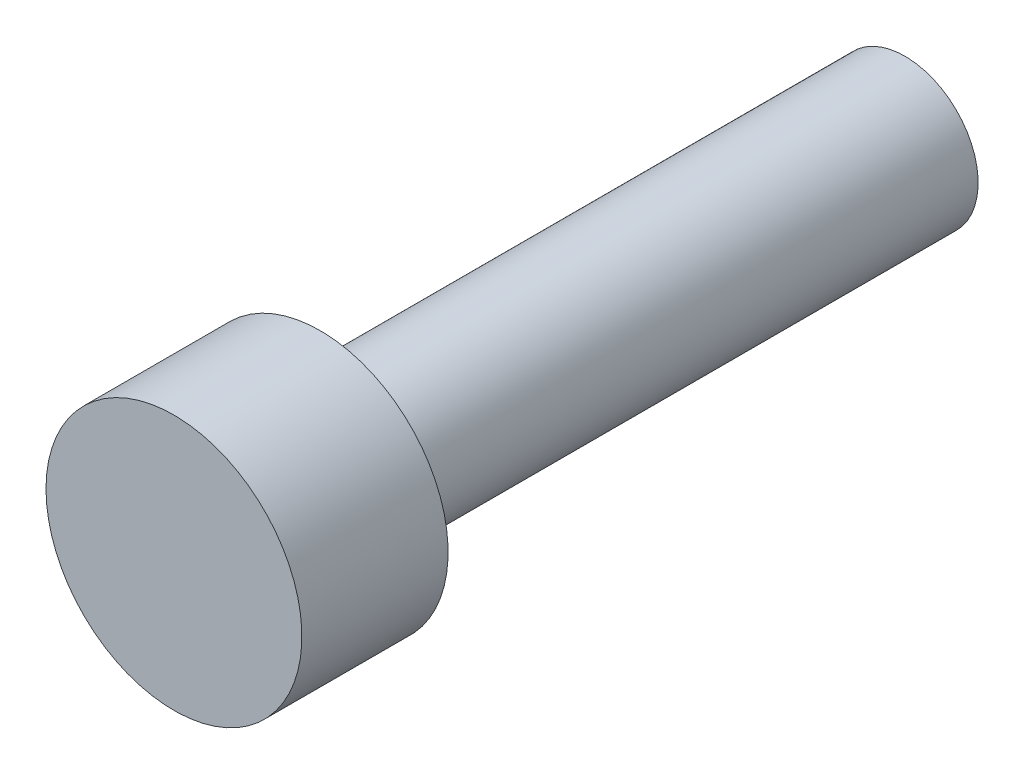
ISO-10303-21;
HEADER;
FILE_DESCRIPTION(('STEP AP214'),'2;1');
FILE_NAME('part.step','',(''),(''),'','','');
FILE_SCHEMA(('AUTOMOTIVE_DESIGN { 1 0 10303 214 1 1 1 1 }'));
ENDSEC;
DATA;
#1=APPLICATION_CONTEXT('core data for automotive mechanical design processes');
#2=APPLICATION_PROTOCOL_DEFINITION('international standard','automotive_design',2000,#1);
#3=PRODUCT_CONTEXT('',#1,'mechanical');
#4=PRODUCT('Part','Part','',(#3));
#5=PRODUCT_RELATED_PRODUCT_CATEGORY('part','',(#4));
#6=PRODUCT_DEFINITION_FORMATION('','',#4);
#7=PRODUCT_DEFINITION_CONTEXT('part definition',#1,'design');
#8=PRODUCT_DEFINITION('design','',#6,#7);
#9=PRODUCT_DEFINITION_SHAPE('','',#8);
#10=(LENGTH_UNIT() NAMED_UNIT(*) SI_UNIT(.MILLI.,.METRE.));
#11=(NAMED_UNIT(*) PLANE_ANGLE_UNIT() SI_UNIT($,.RADIAN.));
#12=(NAMED_UNIT(*) SI_UNIT($,.STERADIAN.) SOLID_ANGLE_UNIT());
#13=UNCERTAINTY_MEASURE_WITH_UNIT(LENGTH_MEASURE(1.E-05),#10,'distance_accuracy_value','');
#14=(GEOMETRIC_REPRESENTATION_CONTEXT(3) GLOBAL_UNCERTAINTY_ASSIGNED_CONTEXT((#13)) GLOBAL_UNIT_ASSIGNED_CONTEXT((#10,
#11,#12)) REPRESENTATION_CONTEXT('',''));
#15=CARTESIAN_POINT('',(0.,0.,0.));
#16=DIRECTION('',(0.,0.,1.));
#17=DIRECTION('',(1.,0.,0.));
#18=AXIS2_PLACEMENT_3D('',#15,#16,#17);
#19=CARTESIAN_POINT('',(0.,0.,4.));
#20=DIRECTION('',(0.,0.,-1.));
#21=DIRECTION('',(-1.,0.,0.));
#22=AXIS2_PLACEMENT_3D('',#19,#20,#21);
#23=PLANE('',#22);
#24=CARTESIAN_POINT('',(0.,0.,4.));
#25=DIRECTION('',(0.,0.,-1.));
#26=DIRECTION('',(-1.,0.,0.));
#27=AXIS2_PLACEMENT_3D('',#24,#25,#26);
#28=CIRCLE('',#27,3.5);
#29=CARTESIAN_POINT('',(-3.5,0.,4.));
#30=VERTEX_POINT('',#29);
#31=EDGE_CURVE('E10',#30,#30,#28,.T.);
#32=ORIENTED_EDGE('',*,*,#31,.F.);
#33=EDGE_LOOP('',(#32));
#34=FACE_BOUND('',#33,.T.);
#35=ADVANCED_FACE('F34',(#34),#23,.F.);
#36=CARTESIAN_POINT('',(0.,0.,-16.));
#37=DIRECTION('',(0.,0.,-1.));
#38=DIRECTION('',(-1.,0.,0.));
#39=AXIS2_PLACEMENT_3D('',#36,#37,#38);
#40=CYLINDRICAL_SURFACE('',#39,3.5);
#41=CARTESIAN_POINT('',(0.,0.,0.));
#42=DIRECTION('',(0.,0.,-1.));
#43=DIRECTION('',(-1.,0.,0.));
#44=AXIS2_PLACEMENT_3D('',#41,#42,#43);
#45=CIRCLE('',#44,3.5);
#46=CARTESIAN_POINT('',(-3.5,0.,0.));
#47=VERTEX_POINT('',#46);
#48=EDGE_CURVE('E45',#47,#47,#45,.T.);
#49=ORIENTED_EDGE('',*,*,#48,.F.);
#50=EDGE_LOOP('',(#49));
#51=FACE_BOUND('',#50,.T.);
#52=ORIENTED_EDGE('',*,*,#31,.T.);
#53=EDGE_LOOP('',(#52));
#54=FACE_BOUND('',#53,.T.);
#55=ADVANCED_FACE('F75',(#51,#54),#40,.T.);
#56=CARTESIAN_POINT('',(3.5,0.,0.));
#57=DIRECTION('',(0.,0.,1.));
#58=DIRECTION('',(1.,0.,0.));
#59=AXIS2_PLACEMENT_3D('',#56,#57,#58);
#60=PLANE('',#59);
#61=CARTESIAN_POINT('',(0.,0.,0.));
#62=DIRECTION('',(0.,0.,-1.));
#63=DIRECTION('',(-1.,0.,0.));
#64=AXIS2_PLACEMENT_3D('',#61,#62,#63);
#65=CIRCLE('',#64,2.);
#66=CARTESIAN_POINT('',(-2.,0.,0.));
#67=VERTEX_POINT('',#66);
#68=EDGE_CURVE('E48',#67,#67,#65,.T.);
#69=ORIENTED_EDGE('',*,*,#68,.F.);
#70=EDGE_LOOP('',(#69));
#71=FACE_BOUND('',#70,.T.);
#72=ORIENTED_EDGE('',*,*,#48,.T.);
#73=EDGE_LOOP('',(#72));
#74=FACE_BOUND('',#73,.T.);
#75=ADVANCED_FACE('F67',(#71,#74),#60,.F.);
#76=CARTESIAN_POINT('',(0.,0.,-16.));
#77=DIRECTION('',(0.,0.,-1.));
#78=DIRECTION('',(-1.,0.,0.));
#79=AXIS2_PLACEMENT_3D('',#76,#77,#78);
#80=CYLINDRICAL_SURFACE('',#79,2.);
#81=CARTESIAN_POINT('',(0.,0.,-16.));
#82=DIRECTION('',(0.,0.,-1.));
#83=DIRECTION('',(-1.,0.,0.));
#84=AXIS2_PLACEMENT_3D('',#81,#82,#83);
#85=CIRCLE('',#84,2.);
#86=CARTESIAN_POINT('',(-2.00000000000001,0.,-16.));
#87=VERTEX_POINT('',#86);
#88=EDGE_CURVE('E53',#87,#87,#85,.T.);
#89=ORIENTED_EDGE('',*,*,#88,.F.);
#90=EDGE_LOOP('',(#89));
#91=FACE_BOUND('',#90,.T.);
#92=ORIENTED_EDGE('',*,*,#68,.T.);
#93=EDGE_LOOP('',(#92));
#94=FACE_BOUND('',#93,.T.);
#95=ADVANCED_FACE('F61',(#91,#94),#80,.T.);
#96=CARTESIAN_POINT('',(1.99999999999999,0.,-16.));
#97=DIRECTION('',(0.,0.,1.));
#98=DIRECTION('',(1.,0.,0.));
#99=AXIS2_PLACEMENT_3D('',#96,#97,#98);
#100=PLANE('',#99);
#101=ORIENTED_EDGE('',*,*,#88,.T.);
#102=EDGE_LOOP('',(#101));
#103=FACE_BOUND('',#102,.T.);
#104=ADVANCED_FACE('F65',(#103),#100,.F.);
#105=CLOSED_SHELL('',(#35,#55,#75,#95,#104));
#106=MANIFOLD_SOLID_BREP('B2',#105);
#107=ADVANCED_BREP_SHAPE_REPRESENTATION('',(#18,#106),#14);
#108=SHAPE_DEFINITION_REPRESENTATION(#9,#107);
ENDSEC;
END-ISO-10303-21;
